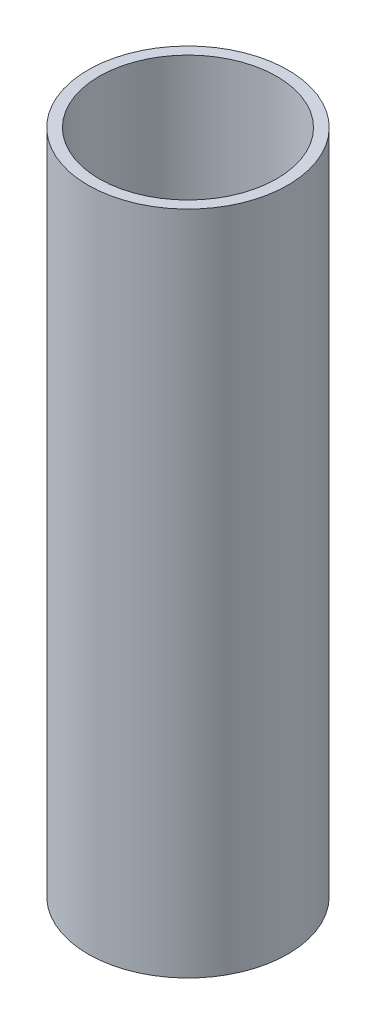
ISO-10303-21;
HEADER;
FILE_DESCRIPTION(('STEP AP214'),'2;1');
FILE_NAME('part.step','',(''),(''),'','','');
FILE_SCHEMA(('AUTOMOTIVE_DESIGN { 1 0 10303 214 1 1 1 1 }'));
ENDSEC;
DATA;
#1=APPLICATION_CONTEXT('core data for automotive mechanical design processes');
#2=APPLICATION_PROTOCOL_DEFINITION('international standard','automotive_design',2000,#1);
#3=PRODUCT_CONTEXT('',#1,'mechanical');
#4=PRODUCT('Part','Part','',(#3));
#5=PRODUCT_RELATED_PRODUCT_CATEGORY('part','',(#4));
#6=PRODUCT_DEFINITION_FORMATION('','',#4);
#7=PRODUCT_DEFINITION_CONTEXT('part definition',#1,'design');
#8=PRODUCT_DEFINITION('design','',#6,#7);
#9=PRODUCT_DEFINITION_SHAPE('','',#8);
#10=(LENGTH_UNIT() NAMED_UNIT(*) SI_UNIT(.MILLI.,.METRE.));
#11=(NAMED_UNIT(*) PLANE_ANGLE_UNIT() SI_UNIT($,.RADIAN.));
#12=(NAMED_UNIT(*) SI_UNIT($,.STERADIAN.) SOLID_ANGLE_UNIT());
#13=UNCERTAINTY_MEASURE_WITH_UNIT(LENGTH_MEASURE(1.E-05),#10,'distance_accuracy_value','');
#14=(GEOMETRIC_REPRESENTATION_CONTEXT(3) GLOBAL_UNCERTAINTY_ASSIGNED_CONTEXT((#13)) GLOBAL_UNIT_ASSIGNED_CONTEXT((#10,
#11,#12)) REPRESENTATION_CONTEXT('',''));
#15=CARTESIAN_POINT('',(0.,0.,0.));
#16=DIRECTION('',(0.,0.,1.));
#17=DIRECTION('',(1.,0.,0.));
#18=AXIS2_PLACEMENT_3D('',#15,#16,#17);
#19=CARTESIAN_POINT('',(0.,300.,0.));
#20=DIRECTION('',(0.,1.,0.));
#21=DIRECTION('',(0.,0.,1.));
#22=AXIS2_PLACEMENT_3D('',#19,#20,#21);
#23=PLANE('',#22);
#24=CARTESIAN_POINT('',(0.,300.,0.));
#25=DIRECTION('',(0.,1.,0.));
#26=DIRECTION('',(0.,0.,1.));
#27=AXIS2_PLACEMENT_3D('',#24,#25,#26);
#28=CIRCLE('',#27,45.);
#29=CARTESIAN_POINT('',(0.,300.,45.));
#30=VERTEX_POINT('',#29);
#31=EDGE_CURVE('E10',#30,#30,#28,.T.);
#32=ORIENTED_EDGE('',*,*,#31,.T.);
#33=EDGE_LOOP('',(#32));
#34=FACE_BOUND('',#33,.T.);
#35=CARTESIAN_POINT('',(0.,300.,0.));
#36=DIRECTION('',(0.,1.,0.));
#37=DIRECTION('',(0.,0.,1.));
#38=AXIS2_PLACEMENT_3D('',#35,#36,#37);
#39=CIRCLE('',#38,40.);
#40=CARTESIAN_POINT('',(0.,300.,40.));
#41=VERTEX_POINT('',#40);
#42=EDGE_CURVE('E56',#41,#41,#39,.T.);
#43=ORIENTED_EDGE('',*,*,#42,.F.);
#44=EDGE_LOOP('',(#43));
#45=FACE_BOUND('',#44,.T.);
#46=ADVANCED_FACE('F43',(#34,#45),#23,.T.);
#47=CARTESIAN_POINT('',(0.,0.,0.));
#48=DIRECTION('',(0.,1.,0.));
#49=DIRECTION('',(0.,0.,1.));
#50=AXIS2_PLACEMENT_3D('',#47,#48,#49);
#51=PLANE('',#50);
#52=CARTESIAN_POINT('',(0.,0.,0.));
#53=DIRECTION('',(0.,1.,0.));
#54=DIRECTION('',(0.,0.,1.));
#55=AXIS2_PLACEMENT_3D('',#52,#53,#54);
#56=CIRCLE('',#55,45.);
#57=CARTESIAN_POINT('',(0.,0.,45.));
#58=VERTEX_POINT('',#57);
#59=EDGE_CURVE('E47',#58,#58,#56,.T.);
#60=ORIENTED_EDGE('',*,*,#59,.F.);
#61=EDGE_LOOP('',(#60));
#62=FACE_BOUND('',#61,.T.);
#63=CARTESIAN_POINT('',(0.,0.,0.));
#64=DIRECTION('',(0.,1.,0.));
#65=DIRECTION('',(0.,0.,1.));
#66=AXIS2_PLACEMENT_3D('',#63,#64,#65);
#67=CIRCLE('',#66,40.);
#68=CARTESIAN_POINT('',(0.,0.,40.));
#69=VERTEX_POINT('',#68);
#70=EDGE_CURVE('E58',#69,#69,#67,.T.);
#71=ORIENTED_EDGE('',*,*,#70,.T.);
#72=EDGE_LOOP('',(#71));
#73=FACE_BOUND('',#72,.T.);
#74=ADVANCED_FACE('F70',(#62,#73),#51,.F.);
#75=CARTESIAN_POINT('',(0.,300.,0.));
#76=DIRECTION('',(0.,-1.,0.));
#77=DIRECTION('',(0.,0.,-1.));
#78=AXIS2_PLACEMENT_3D('',#75,#76,#77);
#79=CYLINDRICAL_SURFACE('',#78,45.);
#80=ORIENTED_EDGE('',*,*,#31,.F.);
#81=EDGE_LOOP('',(#80));
#82=FACE_BOUND('',#81,.T.);
#83=ORIENTED_EDGE('',*,*,#59,.T.);
#84=EDGE_LOOP('',(#83));
#85=FACE_BOUND('',#84,.T.);
#86=ADVANCED_FACE('F45',(#82,#85),#79,.T.);
#87=CARTESIAN_POINT('',(0.,300.,0.));
#88=DIRECTION('',(0.,-1.,0.));
#89=DIRECTION('',(0.,0.,-1.));
#90=AXIS2_PLACEMENT_3D('',#87,#88,#89);
#91=CYLINDRICAL_SURFACE('',#90,40.);
#92=ORIENTED_EDGE('',*,*,#42,.T.);
#93=EDGE_LOOP('',(#92));
#94=FACE_BOUND('',#93,.T.);
#95=ORIENTED_EDGE('',*,*,#70,.F.);
#96=EDGE_LOOP('',(#95));
#97=FACE_BOUND('',#96,.T.);
#98=ADVANCED_FACE('F66',(#94,#97),#91,.F.);
#99=CLOSED_SHELL('',(#46,#74,#86,#98));
#100=MANIFOLD_SOLID_BREP('B2',#99);
#101=ADVANCED_BREP_SHAPE_REPRESENTATION('',(#18,#100),#14);
#102=SHAPE_DEFINITION_REPRESENTATION(#9,#101);
ENDSEC;
END-ISO-10303-21;
